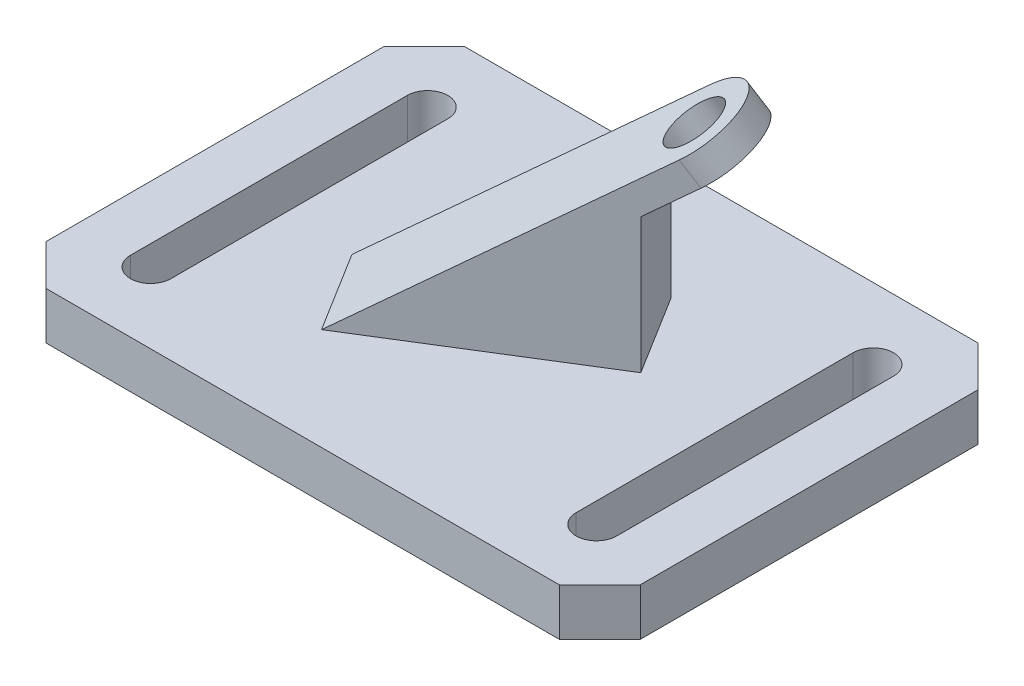
ISO-10303-21;
HEADER;
FILE_DESCRIPTION(('STEP AP214'),'2;1');
FILE_NAME('part.step','',(''),(''),'','','');
FILE_SCHEMA(('AUTOMOTIVE_DESIGN { 1 0 10303 214 1 1 1 1 }'));
ENDSEC;
DATA;
#1=APPLICATION_CONTEXT('core data for automotive mechanical design processes');
#2=APPLICATION_PROTOCOL_DEFINITION('international standard','automotive_design',2000,#1);
#3=PRODUCT_CONTEXT('',#1,'mechanical');
#4=PRODUCT('Part','Part','',(#3));
#5=PRODUCT_RELATED_PRODUCT_CATEGORY('part','',(#4));
#6=PRODUCT_DEFINITION_FORMATION('','',#4);
#7=PRODUCT_DEFINITION_CONTEXT('part definition',#1,'design');
#8=PRODUCT_DEFINITION('design','',#6,#7);
#9=PRODUCT_DEFINITION_SHAPE('','',#8);
#10=(LENGTH_UNIT() NAMED_UNIT(*) SI_UNIT(.MILLI.,.METRE.));
#11=(NAMED_UNIT(*) PLANE_ANGLE_UNIT() SI_UNIT($,.RADIAN.));
#12=(NAMED_UNIT(*) SI_UNIT($,.STERADIAN.) SOLID_ANGLE_UNIT());
#13=UNCERTAINTY_MEASURE_WITH_UNIT(LENGTH_MEASURE(1.E-05),#10,'distance_accuracy_value','');
#14=(GEOMETRIC_REPRESENTATION_CONTEXT(3) GLOBAL_UNCERTAINTY_ASSIGNED_CONTEXT((#13)) GLOBAL_UNIT_ASSIGNED_CONTEXT((#10,
#11,#12)) REPRESENTATION_CONTEXT('',''));
#15=CARTESIAN_POINT('',(0.,0.,0.));
#16=DIRECTION('',(0.,0.,1.));
#17=DIRECTION('',(1.,0.,0.));
#18=AXIS2_PLACEMENT_3D('',#15,#16,#17);
#19=CARTESIAN_POINT('',(0.,7.,0.));
#20=DIRECTION('',(0.,1.,0.));
#21=DIRECTION('',(0.,0.,1.));
#22=AXIS2_PLACEMENT_3D('',#19,#20,#21);
#23=PLANE('',#22);
#24=CARTESIAN_POINT('',(-33.,7.,20.5));
#25=DIRECTION('',(0.,1.,0.));
#26=DIRECTION('',(0.,0.,1.));
#27=AXIS2_PLACEMENT_3D('',#24,#25,#26);
#28=CIRCLE('',#27,3.);
#29=CARTESIAN_POINT('',(-36.,7.,20.5));
#30=VERTEX_POINT('',#29);
#31=CARTESIAN_POINT('',(-30.,7.,20.5));
#32=VERTEX_POINT('',#31);
#33=EDGE_CURVE('E235',#30,#32,#28,.T.);
#34=ORIENTED_EDGE('',*,*,#33,.F.);
#35=DIRECTION('',(0.,0.,1.));
#36=VECTOR('',#35,1.);
#37=CARTESIAN_POINT('',(-36.,7.,0.));
#38=LINE('',#37,#36);
#39=CARTESIAN_POINT('',(-36.,7.,-20.5));
#40=VERTEX_POINT('',#39);
#41=EDGE_CURVE('E238',#40,#30,#38,.T.);
#42=ORIENTED_EDGE('',*,*,#41,.F.);
#43=CARTESIAN_POINT('',(-33.,7.,-20.5));
#44=DIRECTION('',(0.,1.,0.));
#45=DIRECTION('',(0.,0.,1.));
#46=AXIS2_PLACEMENT_3D('',#43,#44,#45);
#47=CIRCLE('',#46,3.);
#48=CARTESIAN_POINT('',(-30.,7.,-20.5));
#49=VERTEX_POINT('',#48);
#50=EDGE_CURVE('E242',#49,#40,#47,.T.);
#51=ORIENTED_EDGE('',*,*,#50,.F.);
#52=DIRECTION('',(0.,0.,1.));
#53=VECTOR('',#52,1.);
#54=CARTESIAN_POINT('',(-30.,7.,0.));
#55=LINE('',#54,#53);
#56=EDGE_CURVE('E245',#49,#32,#55,.T.);
#57=ORIENTED_EDGE('',*,*,#56,.T.);
#58=EDGE_LOOP('',(#34,#42,#51,#57));
#59=FACE_BOUND('',#58,.T.);
#60=DIRECTION('',(0.,0.,1.));
#61=VECTOR('',#60,1.);
#62=CARTESIAN_POINT('',(-44.,7.,0.));
#63=LINE('',#62,#61);
#64=CARTESIAN_POINT('',(-44.,7.,-25.));
#65=VERTEX_POINT('',#64);
#66=CARTESIAN_POINT('',(-44.,7.,25.));
#67=VERTEX_POINT('',#66);
#68=EDGE_CURVE('E247',#65,#67,#63,.T.);
#69=ORIENTED_EDGE('',*,*,#68,.T.);
#70=DIRECTION('',(0.707106781186548,0.,0.707106781186548));
#71=VECTOR('',#70,1.);
#72=CARTESIAN_POINT('',(-34.5,7.,34.5));
#73=LINE('',#72,#71);
#74=CARTESIAN_POINT('',(-38.,7.,31.));
#75=VERTEX_POINT('',#74);
#76=EDGE_CURVE('E250',#67,#75,#73,.T.);
#77=ORIENTED_EDGE('',*,*,#76,.T.);
#78=DIRECTION('',(1.,0.,0.));
#79=VECTOR('',#78,1.);
#80=CARTESIAN_POINT('',(0.,7.,31.));
#81=LINE('',#80,#79);
#82=CARTESIAN_POINT('',(38.,7.,31.));
#83=VERTEX_POINT('',#82);
#84=EDGE_CURVE('E252',#75,#83,#81,.T.);
#85=ORIENTED_EDGE('',*,*,#84,.T.);
#86=DIRECTION('',(0.707106781186548,0.,-0.707106781186548));
#87=VECTOR('',#86,1.);
#88=CARTESIAN_POINT('',(34.5,7.,34.5));
#89=LINE('',#88,#87);
#90=CARTESIAN_POINT('',(44.,7.,25.));
#91=VERTEX_POINT('',#90);
#92=EDGE_CURVE('E254',#83,#91,#89,.T.);
#93=ORIENTED_EDGE('',*,*,#92,.T.);
#94=DIRECTION('',(0.,0.,1.));
#95=VECTOR('',#94,1.);
#96=CARTESIAN_POINT('',(44.,7.,0.));
#97=LINE('',#96,#95);
#98=CARTESIAN_POINT('',(44.,7.,-25.));
#99=VERTEX_POINT('',#98);
#100=EDGE_CURVE('E256',#99,#91,#97,.T.);
#101=ORIENTED_EDGE('',*,*,#100,.F.);
#102=DIRECTION('',(0.707106781186547,0.,0.707106781186548));
#103=VECTOR('',#102,1.);
#104=CARTESIAN_POINT('',(34.5,7.,-34.5));
#105=LINE('',#104,#103);
#106=CARTESIAN_POINT('',(38.,7.,-31.));
#107=VERTEX_POINT('',#106);
#108=EDGE_CURVE('E259',#107,#99,#105,.T.);
#109=ORIENTED_EDGE('',*,*,#108,.F.);
#110=DIRECTION('',(1.,0.,0.));
#111=VECTOR('',#110,1.);
#112=CARTESIAN_POINT('',(0.,7.,-31.));
#113=LINE('',#112,#111);
#114=CARTESIAN_POINT('',(-38.,7.,-31.));
#115=VERTEX_POINT('',#114);
#116=EDGE_CURVE('E262',#115,#107,#113,.T.);
#117=ORIENTED_EDGE('',*,*,#116,.F.);
#118=DIRECTION('',(0.707106781186547,0.,-0.707106781186548));
#119=VECTOR('',#118,1.);
#120=CARTESIAN_POINT('',(-34.5,7.,-34.5));
#121=LINE('',#120,#119);
#122=EDGE_CURVE('E265',#65,#115,#121,.T.);
#123=ORIENTED_EDGE('',*,*,#122,.F.);
#124=EDGE_LOOP('',(#69,#77,#85,#93,#101,#109,#117,#123));
#125=FACE_BOUND('',#124,.T.);
#126=DIRECTION('',(0.,0.,1.));
#127=VECTOR('',#126,1.);
#128=CARTESIAN_POINT('',(36.,7.,0.));
#129=LINE('',#128,#127);
#130=CARTESIAN_POINT('',(36.,7.,-20.5));
#131=VERTEX_POINT('',#130);
#132=CARTESIAN_POINT('',(36.,7.,20.5));
#133=VERTEX_POINT('',#132);
#134=EDGE_CURVE('E268',#131,#133,#129,.T.);
#135=ORIENTED_EDGE('',*,*,#134,.T.);
#136=CARTESIAN_POINT('',(33.,7.,20.5));
#137=DIRECTION('',(0.,1.,0.));
#138=DIRECTION('',(0.,0.,1.));
#139=AXIS2_PLACEMENT_3D('',#136,#137,#138);
#140=CIRCLE('',#139,2.99999999999999);
#141=CARTESIAN_POINT('',(30.,7.,20.5));
#142=VERTEX_POINT('',#141);
#143=EDGE_CURVE('E271',#133,#142,#140,.F.);
#144=ORIENTED_EDGE('',*,*,#143,.T.);
#145=DIRECTION('',(0.,0.,1.));
#146=VECTOR('',#145,1.);
#147=CARTESIAN_POINT('',(30.,7.,0.));
#148=LINE('',#147,#146);
#149=CARTESIAN_POINT('',(30.,7.,-20.5));
#150=VERTEX_POINT('',#149);
#151=EDGE_CURVE('E273',#150,#142,#148,.T.);
#152=ORIENTED_EDGE('',*,*,#151,.F.);
#153=CARTESIAN_POINT('',(33.,7.,-20.5));
#154=DIRECTION('',(0.,1.,0.));
#155=DIRECTION('',(0.,0.,1.));
#156=AXIS2_PLACEMENT_3D('',#153,#154,#155);
#157=CIRCLE('',#156,3.);
#158=EDGE_CURVE('E276',#150,#131,#157,.F.);
#159=ORIENTED_EDGE('',*,*,#158,.T.);
#160=EDGE_LOOP('',(#135,#144,#152,#159));
#161=FACE_BOUND('',#160,.T.);
#162=DIRECTION('',(0.849441251034907,0.,-0.527683201400472));
#163=VECTOR('',#162,1.);
#164=CARTESIAN_POINT('',(16.8463421337623,7.00000000000001,-2.22444076824533));
#165=LINE('',#164,#163);
#166=CARTESIAN_POINT('',(-12.3173925694986,7.,15.8924247292349));
#167=VERTEX_POINT('',#166);
#168=CARTESIAN_POINT('',(16.8463421337623,7.00000000000001,-2.22444076824533));
#169=VERTEX_POINT('',#168);
#170=EDGE_CURVE('E60',#167,#169,#165,.T.);
#171=ORIENTED_EDGE('',*,*,#170,.F.);
#172=DIRECTION('',(0.527683201400473,0.,0.849441251034907));
#173=VECTOR('',#172,1.);
#174=CARTESIAN_POINT('',(-16.0111749793019,7.,9.94633597199056));
#175=LINE('',#174,#173);
#176=CARTESIAN_POINT('',(-19.7049573891052,7.,4.0002472147462));
#177=VERTEX_POINT('',#176);
#178=EDGE_CURVE('E11',#177,#167,#175,.T.);
#179=ORIENTED_EDGE('',*,*,#178,.F.);
#180=DIRECTION('',(0.849441251034907,0.,-0.527683201400472));
#181=VECTOR('',#180,1.);
#182=CARTESIAN_POINT('',(9.4587773141557,7.00000000000001,-14.116618282734));
#183=LINE('',#182,#181);
#184=CARTESIAN_POINT('',(9.45877731415569,7.,-14.116618282734));
#185=VERTEX_POINT('',#184);
#186=EDGE_CURVE('E67',#177,#185,#183,.T.);
#187=ORIENTED_EDGE('',*,*,#186,.T.);
#188=DIRECTION('',(-0.527683201400473,0.,-0.849441251034907));
#189=VECTOR('',#188,1.);
#190=CARTESIAN_POINT('',(16.8463421337623,7.00000000000001,-2.22444076824533));
#191=LINE('',#190,#189);
#192=EDGE_CURVE('E232',#169,#185,#191,.T.);
#193=ORIENTED_EDGE('',*,*,#192,.F.);
#194=EDGE_LOOP('',(#171,#179,#187,#193));
#195=FACE_BOUND('',#194,.T.);
#196=ADVANCED_FACE('F45',(#59,#125,#161,#195),#23,.T.);
#197=CARTESIAN_POINT('',(36.,7.,0.));
#198=DIRECTION('',(1.,0.,0.));
#199=DIRECTION('',(0.,0.,-1.));
#200=AXIS2_PLACEMENT_3D('',#197,#198,#199);
#201=PLANE('',#200);
#202=DIRECTION('',(0.,0.,1.));
#203=VECTOR('',#202,1.);
#204=CARTESIAN_POINT('',(36.,0.,0.));
#205=LINE('',#204,#203);
#206=CARTESIAN_POINT('',(36.,0.,-20.5));
#207=VERTEX_POINT('',#206);
#208=CARTESIAN_POINT('',(36.,0.,20.5));
#209=VERTEX_POINT('',#208);
#210=EDGE_CURVE('E312',#207,#209,#205,.T.);
#211=ORIENTED_EDGE('',*,*,#210,.T.);
#212=DIRECTION('',(0.,-1.,0.));
#213=VECTOR('',#212,1.);
#214=CARTESIAN_POINT('',(36.,7.,20.5));
#215=LINE('',#214,#213);
#216=EDGE_CURVE('E53',#133,#209,#215,.T.);
#217=ORIENTED_EDGE('',*,*,#216,.F.);
#218=ORIENTED_EDGE('',*,*,#134,.F.);
#219=DIRECTION('',(0.,-1.,0.));
#220=VECTOR('',#219,1.);
#221=CARTESIAN_POINT('',(36.,7.,-20.5));
#222=LINE('',#221,#220);
#223=EDGE_CURVE('E322',#131,#207,#222,.T.);
#224=ORIENTED_EDGE('',*,*,#223,.T.);
#225=EDGE_LOOP('',(#211,#217,#218,#224));
#226=FACE_BOUND('',#225,.T.);
#227=ADVANCED_FACE('F391',(#226),#201,.F.);
#228=CARTESIAN_POINT('',(33.,7.,20.5));
#229=DIRECTION('',(0.,-1.,0.));
#230=DIRECTION('',(0.,0.,-1.));
#231=AXIS2_PLACEMENT_3D('',#228,#229,#230);
#232=CYLINDRICAL_SURFACE('',#231,2.99999999999999);
#233=CARTESIAN_POINT('',(33.,0.,20.5));
#234=DIRECTION('',(0.,1.,0.));
#235=DIRECTION('',(0.,0.,1.));
#236=AXIS2_PLACEMENT_3D('',#233,#234,#235);
#237=CIRCLE('',#236,2.99999999999999);
#238=CARTESIAN_POINT('',(30.,0.,20.5));
#239=VERTEX_POINT('',#238);
#240=EDGE_CURVE('E315',#209,#239,#237,.F.);
#241=ORIENTED_EDGE('',*,*,#240,.T.);
#242=DIRECTION('',(0.,-1.,0.));
#243=VECTOR('',#242,1.);
#244=CARTESIAN_POINT('',(30.,7.,20.5));
#245=LINE('',#244,#243);
#246=EDGE_CURVE('E328',#142,#239,#245,.T.);
#247=ORIENTED_EDGE('',*,*,#246,.F.);
#248=ORIENTED_EDGE('',*,*,#143,.F.);
#249=ORIENTED_EDGE('',*,*,#216,.T.);
#250=EDGE_LOOP('',(#241,#247,#248,#249));
#251=FACE_BOUND('',#250,.T.);
#252=ADVANCED_FACE('F398',(#251),#232,.F.);
#253=CARTESIAN_POINT('',(30.,7.,0.));
#254=DIRECTION('',(1.,0.,0.));
#255=DIRECTION('',(0.,0.,-1.));
#256=AXIS2_PLACEMENT_3D('',#253,#254,#255);
#257=PLANE('',#256);
#258=DIRECTION('',(0.,0.,1.));
#259=VECTOR('',#258,1.);
#260=CARTESIAN_POINT('',(30.,0.,0.));
#261=LINE('',#260,#259);
#262=CARTESIAN_POINT('',(30.,0.,-20.5));
#263=VERTEX_POINT('',#262);
#264=EDGE_CURVE('E318',#263,#239,#261,.T.);
#265=ORIENTED_EDGE('',*,*,#264,.F.);
#266=DIRECTION('',(0.,-1.,0.));
#267=VECTOR('',#266,1.);
#268=CARTESIAN_POINT('',(30.,7.,-20.5));
#269=LINE('',#268,#267);
#270=EDGE_CURVE('E325',#150,#263,#269,.T.);
#271=ORIENTED_EDGE('',*,*,#270,.F.);
#272=ORIENTED_EDGE('',*,*,#151,.T.);
#273=ORIENTED_EDGE('',*,*,#246,.T.);
#274=EDGE_LOOP('',(#265,#271,#272,#273));
#275=FACE_BOUND('',#274,.T.);
#276=ADVANCED_FACE('F406',(#275),#257,.T.);
#277=CARTESIAN_POINT('',(-44.,7.,0.));
#278=DIRECTION('',(1.,0.,0.));
#279=DIRECTION('',(0.,0.,-1.));
#280=AXIS2_PLACEMENT_3D('',#277,#278,#279);
#281=PLANE('',#280);
#282=DIRECTION('',(0.,0.,1.));
#283=VECTOR('',#282,1.);
#284=CARTESIAN_POINT('',(-44.,0.,0.));
#285=LINE('',#284,#283);
#286=CARTESIAN_POINT('',(-44.,0.,-25.));
#287=VERTEX_POINT('',#286);
#288=CARTESIAN_POINT('',(-44.,0.,25.));
#289=VERTEX_POINT('',#288);
#290=EDGE_CURVE('E290',#287,#289,#285,.T.);
#291=ORIENTED_EDGE('',*,*,#290,.T.);
#292=DIRECTION('',(0.,-1.,0.));
#293=VECTOR('',#292,1.);
#294=CARTESIAN_POINT('',(-44.,7.,25.));
#295=LINE('',#294,#293);
#296=EDGE_CURVE('E326',#67,#289,#295,.T.);
#297=ORIENTED_EDGE('',*,*,#296,.F.);
#298=ORIENTED_EDGE('',*,*,#68,.F.);
#299=DIRECTION('',(0.,-1.,0.));
#300=VECTOR('',#299,1.);
#301=CARTESIAN_POINT('',(-44.,7.,-25.));
#302=LINE('',#301,#300);
#303=EDGE_CURVE('E332',#65,#287,#302,.T.);
#304=ORIENTED_EDGE('',*,*,#303,.T.);
#305=EDGE_LOOP('',(#291,#297,#298,#304));
#306=FACE_BOUND('',#305,.T.);
#307=ADVANCED_FACE('F409',(#306),#281,.F.);
#308=CARTESIAN_POINT('',(-34.5,7.,34.5));
#309=DIRECTION('',(0.707106781186547,0.,-0.707106781186547));
#310=DIRECTION('',(-0.707106781186548,0.,-0.707106781186548));
#311=AXIS2_PLACEMENT_3D('',#308,#309,#310);
#312=PLANE('',#311);
#313=DIRECTION('',(0.707106781186548,0.,0.707106781186548));
#314=VECTOR('',#313,1.);
#315=CARTESIAN_POINT('',(-34.5,0.,34.5));
#316=LINE('',#315,#314);
#317=CARTESIAN_POINT('',(-38.,0.,31.));
#318=VERTEX_POINT('',#317);
#319=EDGE_CURVE('E293',#289,#318,#316,.T.);
#320=ORIENTED_EDGE('',*,*,#319,.T.);
#321=DIRECTION('',(0.,-1.,0.));
#322=VECTOR('',#321,1.);
#323=CARTESIAN_POINT('',(-38.,7.,31.));
#324=LINE('',#323,#322);
#325=EDGE_CURVE('E346',#75,#318,#324,.T.);
#326=ORIENTED_EDGE('',*,*,#325,.F.);
#327=ORIENTED_EDGE('',*,*,#76,.F.);
#328=ORIENTED_EDGE('',*,*,#296,.T.);
#329=EDGE_LOOP('',(#320,#326,#327,#328));
#330=FACE_BOUND('',#329,.T.);
#331=ADVANCED_FACE('F433',(#330),#312,.F.);
#332=CARTESIAN_POINT('',(0.,7.,31.));
#333=DIRECTION('',(0.,0.,-1.));
#334=DIRECTION('',(-1.,0.,0.));
#335=AXIS2_PLACEMENT_3D('',#332,#333,#334);
#336=PLANE('',#335);
#337=DIRECTION('',(1.,0.,0.));
#338=VECTOR('',#337,1.);
#339=CARTESIAN_POINT('',(0.,0.,31.));
#340=LINE('',#339,#338);
#341=CARTESIAN_POINT('',(38.,0.,31.));
#342=VERTEX_POINT('',#341);
#343=EDGE_CURVE('E295',#318,#342,#340,.T.);
#344=ORIENTED_EDGE('',*,*,#343,.T.);
#345=DIRECTION('',(0.,-1.,0.));
#346=VECTOR('',#345,1.);
#347=CARTESIAN_POINT('',(38.,7.,31.));
#348=LINE('',#347,#346);
#349=EDGE_CURVE('E343',#83,#342,#348,.T.);
#350=ORIENTED_EDGE('',*,*,#349,.F.);
#351=ORIENTED_EDGE('',*,*,#84,.F.);
#352=ORIENTED_EDGE('',*,*,#325,.T.);
#353=EDGE_LOOP('',(#344,#350,#351,#352));
#354=FACE_BOUND('',#353,.T.);
#355=ADVANCED_FACE('F429',(#354),#336,.F.);
#356=CARTESIAN_POINT('',(34.5,7.,34.5));
#357=DIRECTION('',(-0.707106781186547,0.,-0.707106781186547));
#358=DIRECTION('',(-0.707106781186548,0.,0.707106781186548));
#359=AXIS2_PLACEMENT_3D('',#356,#357,#358);
#360=PLANE('',#359);
#361=DIRECTION('',(0.707106781186548,0.,-0.707106781186548));
#362=VECTOR('',#361,1.);
#363=CARTESIAN_POINT('',(34.5,0.,34.5));
#364=LINE('',#363,#362);
#365=CARTESIAN_POINT('',(44.,0.,25.));
#366=VERTEX_POINT('',#365);
#367=EDGE_CURVE('E297',#342,#366,#364,.T.);
#368=ORIENTED_EDGE('',*,*,#367,.T.);
#369=DIRECTION('',(0.,-1.,0.));
#370=VECTOR('',#369,1.);
#371=CARTESIAN_POINT('',(44.,7.,25.));
#372=LINE('',#371,#370);
#373=EDGE_CURVE('E341',#91,#366,#372,.T.);
#374=ORIENTED_EDGE('',*,*,#373,.F.);
#375=ORIENTED_EDGE('',*,*,#92,.F.);
#376=ORIENTED_EDGE('',*,*,#349,.T.);
#377=EDGE_LOOP('',(#368,#374,#375,#376));
#378=FACE_BOUND('',#377,.T.);
#379=ADVANCED_FACE('F425',(#378),#360,.F.);
#380=CARTESIAN_POINT('',(44.,7.,0.));
#381=DIRECTION('',(1.,0.,0.));
#382=DIRECTION('',(0.,0.,-1.));
#383=AXIS2_PLACEMENT_3D('',#380,#381,#382);
#384=PLANE('',#383);
#385=DIRECTION('',(0.,0.,1.));
#386=VECTOR('',#385,1.);
#387=CARTESIAN_POINT('',(44.,0.,0.));
#388=LINE('',#387,#386);
#389=CARTESIAN_POINT('',(44.,0.,-25.));
#390=VERTEX_POINT('',#389);
#391=EDGE_CURVE('E300',#390,#366,#388,.T.);
#392=ORIENTED_EDGE('',*,*,#391,.F.);
#393=DIRECTION('',(0.,-1.,0.));
#394=VECTOR('',#393,1.);
#395=CARTESIAN_POINT('',(44.,7.,-25.));
#396=LINE('',#395,#394);
#397=EDGE_CURVE('E339',#99,#390,#396,.T.);
#398=ORIENTED_EDGE('',*,*,#397,.F.);
#399=ORIENTED_EDGE('',*,*,#100,.T.);
#400=ORIENTED_EDGE('',*,*,#373,.T.);
#401=EDGE_LOOP('',(#392,#398,#399,#400));
#402=FACE_BOUND('',#401,.T.);
#403=ADVANCED_FACE('F421',(#402),#384,.T.);
#404=CARTESIAN_POINT('',(34.5,7.,-34.5));
#405=DIRECTION('',(0.707106781186548,0.,-0.707106781186547));
#406=DIRECTION('',(-0.707106781186547,0.,-0.707106781186548));
#407=AXIS2_PLACEMENT_3D('',#404,#405,#406);
#408=PLANE('',#407);
#409=DIRECTION('',(0.707106781186547,0.,0.707106781186548));
#410=VECTOR('',#409,1.);
#411=CARTESIAN_POINT('',(34.5,0.,-34.5));
#412=LINE('',#411,#410);
#413=CARTESIAN_POINT('',(38.,0.,-31.));
#414=VERTEX_POINT('',#413);
#415=EDGE_CURVE('E303',#414,#390,#412,.T.);
#416=ORIENTED_EDGE('',*,*,#415,.F.);
#417=DIRECTION('',(0.,-1.,0.));
#418=VECTOR('',#417,1.);
#419=CARTESIAN_POINT('',(38.,7.,-31.));
#420=LINE('',#419,#418);
#421=EDGE_CURVE('E337',#107,#414,#420,.T.);
#422=ORIENTED_EDGE('',*,*,#421,.F.);
#423=ORIENTED_EDGE('',*,*,#108,.T.);
#424=ORIENTED_EDGE('',*,*,#397,.T.);
#425=EDGE_LOOP('',(#416,#422,#423,#424));
#426=FACE_BOUND('',#425,.T.);
#427=ADVANCED_FACE('F417',(#426),#408,.T.);
#428=CARTESIAN_POINT('',(0.,7.,-31.));
#429=DIRECTION('',(0.,0.,-1.));
#430=DIRECTION('',(-1.,0.,0.));
#431=AXIS2_PLACEMENT_3D('',#428,#429,#430);
#432=PLANE('',#431);
#433=DIRECTION('',(1.,0.,0.));
#434=VECTOR('',#433,1.);
#435=CARTESIAN_POINT('',(0.,0.,-31.));
#436=LINE('',#435,#434);
#437=CARTESIAN_POINT('',(-38.,0.,-31.));
#438=VERTEX_POINT('',#437);
#439=EDGE_CURVE('E306',#438,#414,#436,.T.);
#440=ORIENTED_EDGE('',*,*,#439,.F.);
#441=DIRECTION('',(0.,-1.,0.));
#442=VECTOR('',#441,1.);
#443=CARTESIAN_POINT('',(-38.,7.,-31.));
#444=LINE('',#443,#442);
#445=EDGE_CURVE('E334',#115,#438,#444,.T.);
#446=ORIENTED_EDGE('',*,*,#445,.F.);
#447=ORIENTED_EDGE('',*,*,#116,.T.);
#448=ORIENTED_EDGE('',*,*,#421,.T.);
#449=EDGE_LOOP('',(#440,#446,#447,#448));
#450=FACE_BOUND('',#449,.T.);
#451=ADVANCED_FACE('F414',(#450),#432,.T.);
#452=CARTESIAN_POINT('',(-33.,7.,20.5));
#453=DIRECTION('',(0.,-1.,0.));
#454=DIRECTION('',(0.,0.,-1.));
#455=AXIS2_PLACEMENT_3D('',#452,#453,#454);
#456=CYLINDRICAL_SURFACE('',#455,3.);
#457=CARTESIAN_POINT('',(-33.,0.,20.5));
#458=DIRECTION('',(0.,1.,0.));
#459=DIRECTION('',(0.,0.,1.));
#460=AXIS2_PLACEMENT_3D('',#457,#458,#459);
#461=CIRCLE('',#460,3.);
#462=CARTESIAN_POINT('',(-36.,0.,20.5));
#463=VERTEX_POINT('',#462);
#464=CARTESIAN_POINT('',(-30.,0.,20.5));
#465=VERTEX_POINT('',#464);
#466=EDGE_CURVE('E234',#463,#465,#461,.T.);
#467=ORIENTED_EDGE('',*,*,#466,.F.);
#468=DIRECTION('',(0.,-1.,0.));
#469=VECTOR('',#468,1.);
#470=CARTESIAN_POINT('',(-36.,7.,20.5));
#471=LINE('',#470,#469);
#472=EDGE_CURVE('E335',#30,#463,#471,.T.);
#473=ORIENTED_EDGE('',*,*,#472,.F.);
#474=ORIENTED_EDGE('',*,*,#33,.T.);
#475=DIRECTION('',(0.,-1.,0.));
#476=VECTOR('',#475,1.);
#477=CARTESIAN_POINT('',(-30.,7.,20.5));
#478=LINE('',#477,#476);
#479=EDGE_CURVE('E278',#32,#465,#478,.T.);
#480=ORIENTED_EDGE('',*,*,#479,.T.);
#481=EDGE_LOOP('',(#467,#473,#474,#480));
#482=FACE_BOUND('',#481,.T.);
#483=ADVANCED_FACE('F47',(#482),#456,.F.);
#484=CARTESIAN_POINT('',(-36.,7.,0.));
#485=DIRECTION('',(1.,0.,0.));
#486=DIRECTION('',(0.,0.,-1.));
#487=AXIS2_PLACEMENT_3D('',#484,#485,#486);
#488=PLANE('',#487);
#489=DIRECTION('',(0.,0.,1.));
#490=VECTOR('',#489,1.);
#491=CARTESIAN_POINT('',(-36.,0.,0.));
#492=LINE('',#491,#490);
#493=CARTESIAN_POINT('',(-36.,0.,-20.5));
#494=VERTEX_POINT('',#493);
#495=EDGE_CURVE('E281',#494,#463,#492,.T.);
#496=ORIENTED_EDGE('',*,*,#495,.F.);
#497=DIRECTION('',(0.,-1.,0.));
#498=VECTOR('',#497,1.);
#499=CARTESIAN_POINT('',(-36.,7.,-20.5));
#500=LINE('',#499,#498);
#501=EDGE_CURVE('E354',#40,#494,#500,.T.);
#502=ORIENTED_EDGE('',*,*,#501,.F.);
#503=ORIENTED_EDGE('',*,*,#41,.T.);
#504=ORIENTED_EDGE('',*,*,#472,.T.);
#505=EDGE_LOOP('',(#496,#502,#503,#504));
#506=FACE_BOUND('',#505,.T.);
#507=ADVANCED_FACE('F358',(#506),#488,.T.);
#508=CARTESIAN_POINT('',(-33.,7.,-20.5));
#509=DIRECTION('',(0.,-1.,0.));
#510=DIRECTION('',(0.,0.,-1.));
#511=AXIS2_PLACEMENT_3D('',#508,#509,#510);
#512=CYLINDRICAL_SURFACE('',#511,3.);
#513=CARTESIAN_POINT('',(-33.,0.,-20.5));
#514=DIRECTION('',(0.,1.,0.));
#515=DIRECTION('',(0.,0.,1.));
#516=AXIS2_PLACEMENT_3D('',#513,#514,#515);
#517=CIRCLE('',#516,3.);
#518=CARTESIAN_POINT('',(-30.,0.,-20.5));
#519=VERTEX_POINT('',#518);
#520=EDGE_CURVE('E284',#519,#494,#517,.T.);
#521=ORIENTED_EDGE('',*,*,#520,.F.);
#522=DIRECTION('',(0.,-1.,0.));
#523=VECTOR('',#522,1.);
#524=CARTESIAN_POINT('',(-30.,7.,-20.5));
#525=LINE('',#524,#523);
#526=EDGE_CURVE('E352',#49,#519,#525,.T.);
#527=ORIENTED_EDGE('',*,*,#526,.F.);
#528=ORIENTED_EDGE('',*,*,#50,.T.);
#529=ORIENTED_EDGE('',*,*,#501,.T.);
#530=EDGE_LOOP('',(#521,#527,#528,#529));
#531=FACE_BOUND('',#530,.T.);
#532=ADVANCED_FACE('F369',(#531),#512,.F.);
#533=CARTESIAN_POINT('',(-34.5,7.,-34.5));
#534=DIRECTION('',(-0.707106781186548,0.,-0.707106781186547));
#535=DIRECTION('',(-0.707106781186547,0.,0.707106781186548));
#536=AXIS2_PLACEMENT_3D('',#533,#534,#535);
#537=PLANE('',#536);
#538=DIRECTION('',(0.707106781186547,0.,-0.707106781186548));
#539=VECTOR('',#538,1.);
#540=CARTESIAN_POINT('',(-34.5,0.,-34.5));
#541=LINE('',#540,#539);
#542=EDGE_CURVE('E309',#287,#438,#541,.T.);
#543=ORIENTED_EDGE('',*,*,#542,.F.);
#544=ORIENTED_EDGE('',*,*,#303,.F.);
#545=ORIENTED_EDGE('',*,*,#122,.T.);
#546=ORIENTED_EDGE('',*,*,#445,.T.);
#547=EDGE_LOOP('',(#543,#544,#545,#546));
#548=FACE_BOUND('',#547,.T.);
#549=ADVANCED_FACE('F378',(#548),#537,.T.);
#550=CARTESIAN_POINT('',(-30.,7.,0.));
#551=DIRECTION('',(1.,0.,0.));
#552=DIRECTION('',(0.,0.,-1.));
#553=AXIS2_PLACEMENT_3D('',#550,#551,#552);
#554=PLANE('',#553);
#555=DIRECTION('',(0.,0.,1.));
#556=VECTOR('',#555,1.);
#557=CARTESIAN_POINT('',(-30.,0.,0.));
#558=LINE('',#557,#556);
#559=EDGE_CURVE('E287',#519,#465,#558,.T.);
#560=ORIENTED_EDGE('',*,*,#559,.T.);
#561=ORIENTED_EDGE('',*,*,#479,.F.);
#562=ORIENTED_EDGE('',*,*,#56,.F.);
#563=ORIENTED_EDGE('',*,*,#526,.T.);
#564=EDGE_LOOP('',(#560,#561,#562,#563));
#565=FACE_BOUND('',#564,.T.);
#566=ADVANCED_FACE('F375',(#565),#554,.F.);
#567=CARTESIAN_POINT('',(33.,7.,-20.5));
#568=DIRECTION('',(0.,-1.,0.));
#569=DIRECTION('',(0.,0.,-1.));
#570=AXIS2_PLACEMENT_3D('',#567,#568,#569);
#571=CYLINDRICAL_SURFACE('',#570,3.);
#572=CARTESIAN_POINT('',(33.,0.,-20.5));
#573=DIRECTION('',(0.,1.,0.));
#574=DIRECTION('',(0.,0.,1.));
#575=AXIS2_PLACEMENT_3D('',#572,#573,#574);
#576=CIRCLE('',#575,3.);
#577=EDGE_CURVE('E239',#263,#207,#576,.F.);
#578=ORIENTED_EDGE('',*,*,#577,.T.);
#579=ORIENTED_EDGE('',*,*,#223,.F.);
#580=ORIENTED_EDGE('',*,*,#158,.F.);
#581=ORIENTED_EDGE('',*,*,#270,.T.);
#582=EDGE_LOOP('',(#578,#579,#580,#581));
#583=FACE_BOUND('',#582,.T.);
#584=ADVANCED_FACE('F377',(#583),#571,.F.);
#585=CARTESIAN_POINT('',(0.,0.,0.));
#586=DIRECTION('',(0.,1.,0.));
#587=DIRECTION('',(0.,0.,1.));
#588=AXIS2_PLACEMENT_3D('',#585,#586,#587);
#589=PLANE('',#588);
#590=ORIENTED_EDGE('',*,*,#466,.T.);
#591=ORIENTED_EDGE('',*,*,#559,.F.);
#592=ORIENTED_EDGE('',*,*,#520,.T.);
#593=ORIENTED_EDGE('',*,*,#495,.T.);
#594=EDGE_LOOP('',(#590,#591,#592,#593));
#595=FACE_BOUND('',#594,.T.);
#596=ORIENTED_EDGE('',*,*,#290,.F.);
#597=ORIENTED_EDGE('',*,*,#542,.T.);
#598=ORIENTED_EDGE('',*,*,#439,.T.);
#599=ORIENTED_EDGE('',*,*,#415,.T.);
#600=ORIENTED_EDGE('',*,*,#391,.T.);
#601=ORIENTED_EDGE('',*,*,#367,.F.);
#602=ORIENTED_EDGE('',*,*,#343,.F.);
#603=ORIENTED_EDGE('',*,*,#319,.F.);
#604=EDGE_LOOP('',(#596,#597,#598,#599,#600,#601,#602,#603));
#605=FACE_BOUND('',#604,.T.);
#606=ORIENTED_EDGE('',*,*,#210,.F.);
#607=ORIENTED_EDGE('',*,*,#577,.F.);
#608=ORIENTED_EDGE('',*,*,#264,.T.);
#609=ORIENTED_EDGE('',*,*,#240,.F.);
#610=EDGE_LOOP('',(#606,#607,#608,#609));
#611=FACE_BOUND('',#610,.T.);
#612=ADVANCED_FACE('F365',(#595,#605,#611),#589,.F.);
#613=CARTESIAN_POINT('',(16.8463421337623,27.,-2.22444076824533));
#614=DIRECTION('',(-0.849441251034907,0.,0.527683201400473));
#615=DIRECTION('',(0.527683201400473,0.,0.849441251034907));
#616=AXIS2_PLACEMENT_3D('',#613,#614,#615);
#617=PLANE('',#616);
#618=DIRECTION('',(0.,1.,0.));
#619=VECTOR('',#618,1.);
#620=CARTESIAN_POINT('',(9.4587773141557,27.,-14.116618282734));
#621=LINE('',#620,#619);
#622=CARTESIAN_POINT('',(9.4587773141557,27.,-14.116618282734));
#623=VERTEX_POINT('',#622);
#624=EDGE_CURVE('E225',#185,#623,#621,.T.);
#625=ORIENTED_EDGE('',*,*,#624,.T.);
#626=DIRECTION('',(-0.527683201400473,0.,-0.849441251034907));
#627=VECTOR('',#626,1.);
#628=CARTESIAN_POINT('',(16.8463421337623,27.,-2.22444076824533));
#629=LINE('',#628,#627);
#630=CARTESIAN_POINT('',(16.8463421337623,27.,-2.22444076824533));
#631=VERTEX_POINT('',#630);
#632=EDGE_CURVE('E227',#631,#623,#629,.T.);
#633=ORIENTED_EDGE('',*,*,#632,.F.);
#634=DIRECTION('',(0.,1.,0.));
#635=VECTOR('',#634,1.);
#636=CARTESIAN_POINT('',(16.8463421337623,27.,-2.22444076824533));
#637=LINE('',#636,#635);
#638=EDGE_CURVE('E224',#169,#631,#637,.T.);
#639=ORIENTED_EDGE('',*,*,#638,.F.);
#640=ORIENTED_EDGE('',*,*,#192,.T.);
#641=EDGE_LOOP('',(#625,#633,#639,#640));
#642=FACE_BOUND('',#641,.T.);
#643=ADVANCED_FACE('F403',(#642),#617,.F.);
#644=CARTESIAN_POINT('',(3.69378240980331,0.,5.94608875724435));
#645=DIRECTION('',(0.527683201400473,0.,0.849441251034907));
#646=DIRECTION('',(0.849441251034907,0.,-0.527683201400473));
#647=AXIS2_PLACEMENT_3D('',#644,#645,#646);
#648=PLANE('',#647);
#649=ORIENTED_EDGE('',*,*,#170,.T.);
#650=ORIENTED_EDGE('',*,*,#638,.T.);
#651=DIRECTION('',(0.687212407810359,0.587785252292469,-0.426904677579162));
#652=VECTOR('',#651,1.);
#653=CARTESIAN_POINT('',(-10.6600439216374,3.47328848624519,14.862859660109));
#654=LINE('',#653,#652);
#655=CARTESIAN_POINT('',(22.3440413962452,31.7022820183398,-5.63967818887862));
#656=VERTEX_POINT('',#655);
#657=EDGE_CURVE('E204',#631,#656,#654,.T.);
#658=ORIENTED_EDGE('',*,*,#657,.T.);
#659=DIRECTION('',(0.499289040047183,-0.809016994374951,-0.310164403665674));
#660=VECTOR('',#659,1.);
#661=CARTESIAN_POINT('',(20.3468852360564,34.9383499958396,-4.39902057421592));
#662=LINE('',#661,#660);
#663=CARTESIAN_POINT('',(20.3468852360564,34.9383499958396,-4.39902057421592));
#664=VERTEX_POINT('',#663);
#665=EDGE_CURVE('E201',#664,#656,#662,.T.);
#666=ORIENTED_EDGE('',*,*,#665,.F.);
#667=DIRECTION('',(0.687212407810359,0.587785252292469,-0.426904677579162));
#668=VECTOR('',#667,1.);
#669=CARTESIAN_POINT('',(-12.6572000818261,6.70935646374499,16.1035172747717));
#670=LINE('',#669,#668);
#671=EDGE_CURVE('E189',#167,#664,#670,.T.);
#672=ORIENTED_EDGE('',*,*,#671,.F.);
#673=EDGE_LOOP('',(#649,#650,#658,#666,#672));
#674=FACE_BOUND('',#673,.T.);
#675=ADVANCED_FACE('F202',(#674),#648,.T.);
#676=CARTESIAN_POINT('',(-3.69378240980331,0.,-5.94608875724435));
#677=DIRECTION('',(0.527683201400473,0.,0.849441251034907));
#678=DIRECTION('',(0.849441251034907,0.,-0.527683201400473));
#679=AXIS2_PLACEMENT_3D('',#676,#677,#678);
#680=PLANE('',#679);
#681=ORIENTED_EDGE('',*,*,#186,.F.);
#682=DIRECTION('',(-0.687212407810358,-0.587785252292469,0.426904677579162));
#683=VECTOR('',#682,1.);
#684=CARTESIAN_POINT('',(-20.0447649014327,6.70935646374499,4.21133976028301));
#685=LINE('',#684,#683);
#686=CARTESIAN_POINT('',(12.9593204164498,34.9383499958396,-16.2911980887046));
#687=VERTEX_POINT('',#686);
#688=EDGE_CURVE('E211',#687,#177,#685,.T.);
#689=ORIENTED_EDGE('',*,*,#688,.F.);
#690=DIRECTION('',(0.499289040047183,-0.809016994374951,-0.310164403665674));
#691=VECTOR('',#690,1.);
#692=CARTESIAN_POINT('',(12.9593204164498,34.9383499958396,-16.2911980887046));
#693=LINE('',#692,#691);
#694=CARTESIAN_POINT('',(14.9564765766385,31.7022820183398,-17.5318557033673));
#695=VERTEX_POINT('',#694);
#696=EDGE_CURVE('E207',#687,#695,#693,.T.);
#697=ORIENTED_EDGE('',*,*,#696,.T.);
#698=DIRECTION('',(-0.687212407810358,-0.587785252292469,0.426904677579162));
#699=VECTOR('',#698,1.);
#700=CARTESIAN_POINT('',(-18.047608741244,3.47328848624519,2.97068214562031));
#701=LINE('',#700,#699);
#702=EDGE_CURVE('E198',#695,#623,#701,.T.);
#703=ORIENTED_EDGE('',*,*,#702,.T.);
#704=ORIENTED_EDGE('',*,*,#624,.F.);
#705=EDGE_LOOP('',(#681,#689,#697,#703,#704));
#706=FACE_BOUND('',#705,.T.);
#707=ADVANCED_FACE('F562',(#706),#680,.F.);
#708=CARTESIAN_POINT('',(18.6502589864419,31.7022820183398,-11.585766946123));
#709=DIRECTION('',(-0.499289040047183,0.809016994374951,0.310164403665674));
#710=DIRECTION('',(-0.850985081019819,-0.525189862698903,0.));
#711=AXIS2_PLACEMENT_3D('',#708,#709,#710);
#712=PLANE('',#711);
#713=CARTESIAN_POINT('',(18.6502589864419,31.7022820183398,-11.585766946123));
#714=DIRECTION('',(-0.499289040047183,0.809016994374951,0.310164403665674));
#715=DIRECTION('',(-0.850985081019819,-0.525189862698903,0.));
#716=AXIS2_PLACEMENT_3D('',#713,#714,#715);
#717=CIRCLE('',#716,4.);
#718=CARTESIAN_POINT('',(15.2463186623626,29.6015225675442,-11.585766946123));
#719=VERTEX_POINT('',#718);
#720=EDGE_CURVE('E622',#719,#719,#717,.T.);
#721=ORIENTED_EDGE('',*,*,#720,.T.);
#722=EDGE_LOOP('',(#721));
#723=FACE_BOUND('',#722,.T.);
#724=ORIENTED_EDGE('',*,*,#657,.F.);
#725=ORIENTED_EDGE('',*,*,#632,.T.);
#726=ORIENTED_EDGE('',*,*,#702,.F.);
#727=CARTESIAN_POINT('',(18.6502589864419,31.7022820183398,-11.585766946123));
#728=DIRECTION('',(-0.499289040047183,0.809016994374951,0.310164403665674));
#729=DIRECTION('',(-0.850985081019819,-0.525189862698903,0.));
#730=AXIS2_PLACEMENT_3D('',#727,#728,#729);
#731=CIRCLE('',#730,7.00000000000001);
#732=EDGE_CURVE('E217',#656,#695,#731,.T.);
#733=ORIENTED_EDGE('',*,*,#732,.F.);
#734=EDGE_LOOP('',(#724,#725,#726,#733));
#735=FACE_BOUND('',#734,.T.);
#736=ADVANCED_FACE('F573',(#723,#735),#712,.F.);
#737=CARTESIAN_POINT('',(16.6531028262531,34.9383499958396,-10.3451093314603));
#738=DIRECTION('',(-0.499289040047183,0.809016994374951,0.310164403665674));
#739=DIRECTION('',(-0.850985081019819,-0.525189862698903,0.));
#740=AXIS2_PLACEMENT_3D('',#737,#738,#739);
#741=PLANE('',#740);
#742=ORIENTED_EDGE('',*,*,#688,.T.);
#743=ORIENTED_EDGE('',*,*,#178,.T.);
#744=ORIENTED_EDGE('',*,*,#671,.T.);
#745=CARTESIAN_POINT('',(16.6531028262531,34.9383499958396,-10.3451093314603));
#746=DIRECTION('',(-0.499289040047183,0.809016994374951,0.310164403665674));
#747=DIRECTION('',(-0.850985081019819,-0.525189862698903,0.));
#748=AXIS2_PLACEMENT_3D('',#745,#746,#747);
#749=CIRCLE('',#748,7.00000000000001);
#750=EDGE_CURVE('E195',#664,#687,#749,.T.);
#751=ORIENTED_EDGE('',*,*,#750,.T.);
#752=EDGE_LOOP('',(#742,#743,#744,#751));
#753=FACE_BOUND('',#752,.T.);
#754=CARTESIAN_POINT('',(16.6531028262531,34.9383499958396,-10.3451093314603));
#755=DIRECTION('',(-0.499289040047183,0.809016994374951,0.310164403665674));
#756=DIRECTION('',(-0.850985081019819,-0.525189862698903,0.));
#757=AXIS2_PLACEMENT_3D('',#754,#755,#756);
#758=CIRCLE('',#757,4.);
#759=CARTESIAN_POINT('',(13.2491625021738,32.837590545044,-10.3451093314603));
#760=VERTEX_POINT('',#759);
#761=EDGE_CURVE('E218',#760,#760,#758,.T.);
#762=ORIENTED_EDGE('',*,*,#761,.F.);
#763=EDGE_LOOP('',(#762));
#764=FACE_BOUND('',#763,.T.);
#765=ADVANCED_FACE('F192',(#753,#764),#741,.T.);
#766=CARTESIAN_POINT('',(16.6531028262531,34.9383499958396,-10.3451093314603));
#767=DIRECTION('',(0.499289040047183,-0.809016994374951,-0.310164403665674));
#768=DIRECTION('',(0.850985081019819,0.525189862698903,0.));
#769=AXIS2_PLACEMENT_3D('',#766,#767,#768);
#770=CYLINDRICAL_SURFACE('',#769,7.00000000000001);
#771=ORIENTED_EDGE('',*,*,#732,.T.);
#772=ORIENTED_EDGE('',*,*,#696,.F.);
#773=ORIENTED_EDGE('',*,*,#750,.F.);
#774=ORIENTED_EDGE('',*,*,#665,.T.);
#775=EDGE_LOOP('',(#771,#772,#773,#774));
#776=FACE_BOUND('',#775,.T.);
#777=ADVANCED_FACE('F209',(#776),#770,.T.);
#778=CARTESIAN_POINT('',(16.6531028262531,34.9383499958396,-10.3451093314603));
#779=DIRECTION('',(0.499289040047183,-0.809016994374951,-0.310164403665674));
#780=DIRECTION('',(0.850985081019819,0.525189862698903,0.));
#781=AXIS2_PLACEMENT_3D('',#778,#779,#780);
#782=CYLINDRICAL_SURFACE('',#781,4.);
#783=ORIENTED_EDGE('',*,*,#761,.T.);
#784=EDGE_LOOP('',(#783));
#785=FACE_BOUND('',#784,.T.);
#786=ORIENTED_EDGE('',*,*,#720,.F.);
#787=EDGE_LOOP('',(#786));
#788=FACE_BOUND('',#787,.T.);
#789=ADVANCED_FACE('F600',(#785,#788),#782,.F.);
#790=CLOSED_SHELL('',(#196,#227,#252,#276,#307,#331,#355,#379,#403,#427,#451,#483,#507,#532,
#549,#566,#584,#612,#643,#675,#707,#736,#765,#777,#789));
#791=MANIFOLD_SOLID_BREP('B2',#790);
#792=ADVANCED_BREP_SHAPE_REPRESENTATION('',(#18,#791),#14);
#793=SHAPE_DEFINITION_REPRESENTATION(#9,#792);
ENDSEC;
END-ISO-10303-21;
